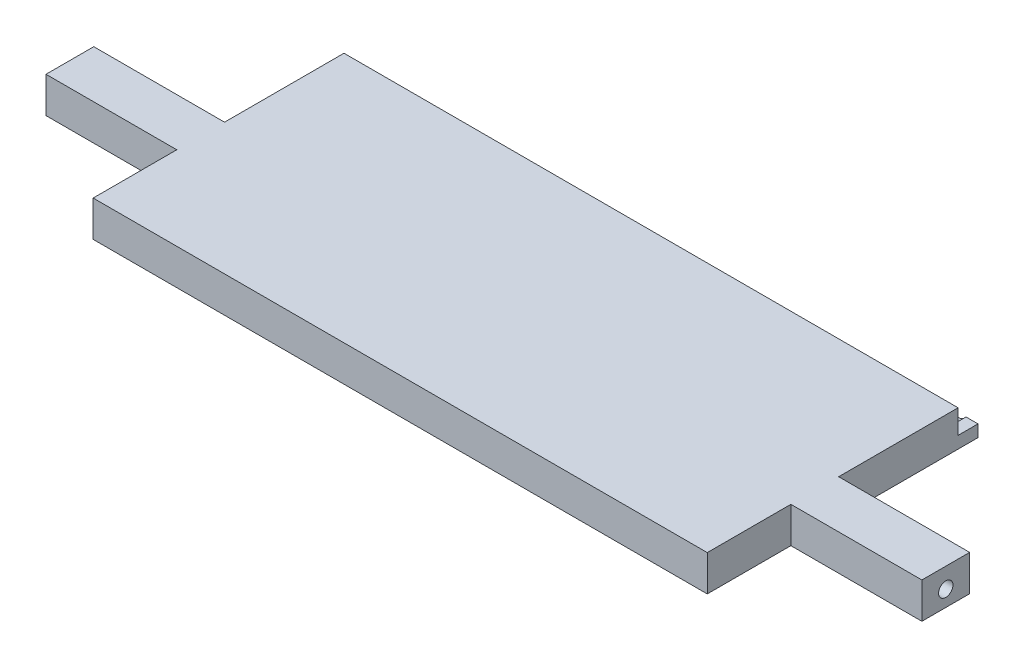
ISO-10303-21;
HEADER;
FILE_DESCRIPTION(('STEP AP214'),'2;1');
FILE_NAME('part.step','',(''),(''),'','','');
FILE_SCHEMA(('AUTOMOTIVE_DESIGN { 1 0 10303 214 1 1 1 1 }'));
ENDSEC;
DATA;
#1=APPLICATION_CONTEXT('core data for automotive mechanical design processes');
#2=APPLICATION_PROTOCOL_DEFINITION('international standard','automotive_design',2000,#1);
#3=PRODUCT_CONTEXT('',#1,'mechanical');
#4=PRODUCT('Part','Part','',(#3));
#5=PRODUCT_RELATED_PRODUCT_CATEGORY('part','',(#4));
#6=PRODUCT_DEFINITION_FORMATION('','',#4);
#7=PRODUCT_DEFINITION_CONTEXT('part definition',#1,'design');
#8=PRODUCT_DEFINITION('design','',#6,#7);
#9=PRODUCT_DEFINITION_SHAPE('','',#8);
#10=(LENGTH_UNIT() NAMED_UNIT(*) SI_UNIT(.MILLI.,.METRE.));
#11=(NAMED_UNIT(*) PLANE_ANGLE_UNIT() SI_UNIT($,.RADIAN.));
#12=(NAMED_UNIT(*) SI_UNIT($,.STERADIAN.) SOLID_ANGLE_UNIT());
#13=UNCERTAINTY_MEASURE_WITH_UNIT(LENGTH_MEASURE(1.E-05),#10,'distance_accuracy_value','');
#14=(GEOMETRIC_REPRESENTATION_CONTEXT(3) GLOBAL_UNCERTAINTY_ASSIGNED_CONTEXT((#13)) GLOBAL_UNIT_ASSIGNED_CONTEXT((#10,
#11,#12)) REPRESENTATION_CONTEXT('',''));
#15=CARTESIAN_POINT('',(0.,0.,0.));
#16=DIRECTION('',(0.,0.,1.));
#17=DIRECTION('',(1.,0.,0.));
#18=AXIS2_PLACEMENT_3D('',#15,#16,#17);
#19=CARTESIAN_POINT('',(0.,0.,0.));
#20=DIRECTION('',(0.,0.,-1.));
#21=DIRECTION('',(-1.,0.,0.));
#22=AXIS2_PLACEMENT_3D('',#19,#20,#21);
#23=PLANE('',#22);
#24=DIRECTION('',(0.,1.,0.));
#25=VECTOR('',#24,1.);
#26=CARTESIAN_POINT('',(187.09367605816,0.,0.));
#27=LINE('',#26,#25);
#28=CARTESIAN_POINT('',(187.09367605816,0.,0.));
#29=VERTEX_POINT('',#28);
#30=CARTESIAN_POINT('',(187.09367605816,3.,0.));
#31=VERTEX_POINT('',#30);
#32=EDGE_CURVE('E316',#29,#31,#27,.T.);
#33=ORIENTED_EDGE('',*,*,#32,.F.);
#34=DIRECTION('',(1.,0.,0.));
#35=VECTOR('',#34,1.);
#36=CARTESIAN_POINT('',(0.,0.,0.));
#37=LINE('',#36,#35);
#38=CARTESIAN_POINT('',(32.8463239418405,0.,0.));
#39=VERTEX_POINT('',#38);
#40=EDGE_CURVE('E474',#39,#29,#37,.T.);
#41=ORIENTED_EDGE('',*,*,#40,.F.);
#42=DIRECTION('',(0.,1.,0.));
#43=VECTOR('',#42,1.);
#44=CARTESIAN_POINT('',(32.8463239418405,0.,0.));
#45=LINE('',#44,#43);
#46=CARTESIAN_POINT('',(32.8463239418405,3.,0.));
#47=VERTEX_POINT('',#46);
#48=EDGE_CURVE('E336',#39,#47,#45,.T.);
#49=ORIENTED_EDGE('',*,*,#48,.T.);
#50=DIRECTION('',(-1.,0.,0.));
#51=VECTOR('',#50,1.);
#52=CARTESIAN_POINT('',(0.,3.,0.));
#53=LINE('',#52,#51);
#54=CARTESIAN_POINT('',(35.8463239418405,3.,0.));
#55=VERTEX_POINT('',#54);
#56=EDGE_CURVE('E349',#55,#47,#53,.T.);
#57=ORIENTED_EDGE('',*,*,#56,.F.);
#58=CARTESIAN_POINT('',(37.97,4.5,0.));
#59=DIRECTION('',(0.,0.,1.));
#60=DIRECTION('',(1.,0.,0.));
#61=AXIS2_PLACEMENT_3D('',#58,#59,#60);
#62=CIRCLE('',#61,2.6);
#63=CARTESIAN_POINT('',(40.0936760581595,3.,0.));
#64=VERTEX_POINT('',#63);
#65=EDGE_CURVE('E469',#55,#64,#62,.T.);
#66=ORIENTED_EDGE('',*,*,#65,.T.);
#67=CARTESIAN_POINT('',(53.8463239418405,3.,0.));
#68=VERTEX_POINT('',#67);
#69=EDGE_CURVE('E510',#68,#64,#53,.T.);
#70=ORIENTED_EDGE('',*,*,#69,.F.);
#71=CARTESIAN_POINT('',(55.97,4.5,0.));
#72=DIRECTION('',(0.,0.,1.));
#73=DIRECTION('',(1.,0.,0.));
#74=AXIS2_PLACEMENT_3D('',#71,#72,#73);
#75=CIRCLE('',#74,2.6);
#76=CARTESIAN_POINT('',(58.0936760581595,3.,0.));
#77=VERTEX_POINT('',#76);
#78=EDGE_CURVE('E464',#68,#77,#75,.T.);
#79=ORIENTED_EDGE('',*,*,#78,.T.);
#80=CARTESIAN_POINT('',(71.8463239418404,3.,0.));
#81=VERTEX_POINT('',#80);
#82=EDGE_CURVE('E511',#81,#77,#53,.T.);
#83=ORIENTED_EDGE('',*,*,#82,.F.);
#84=CARTESIAN_POINT('',(73.97,4.5,0.));
#85=DIRECTION('',(0.,0.,1.));
#86=DIRECTION('',(1.,0.,0.));
#87=AXIS2_PLACEMENT_3D('',#84,#85,#86);
#88=CIRCLE('',#87,2.6);
#89=CARTESIAN_POINT('',(76.0936760581595,3.,0.));
#90=VERTEX_POINT('',#89);
#91=EDGE_CURVE('E458',#81,#90,#88,.T.);
#92=ORIENTED_EDGE('',*,*,#91,.T.);
#93=CARTESIAN_POINT('',(89.8463239418404,3.,0.));
#94=VERTEX_POINT('',#93);
#95=EDGE_CURVE('E514',#94,#90,#53,.T.);
#96=ORIENTED_EDGE('',*,*,#95,.F.);
#97=CARTESIAN_POINT('',(91.97,4.5,0.));
#98=DIRECTION('',(0.,0.,1.));
#99=DIRECTION('',(1.,0.,0.));
#100=AXIS2_PLACEMENT_3D('',#97,#98,#99);
#101=CIRCLE('',#100,2.6);
#102=CARTESIAN_POINT('',(94.0936760581595,3.,0.));
#103=VERTEX_POINT('',#102);
#104=EDGE_CURVE('E452',#94,#103,#101,.T.);
#105=ORIENTED_EDGE('',*,*,#104,.T.);
#106=CARTESIAN_POINT('',(107.84632394184,3.,0.));
#107=VERTEX_POINT('',#106);
#108=EDGE_CURVE('E517',#107,#103,#53,.T.);
#109=ORIENTED_EDGE('',*,*,#108,.F.);
#110=CARTESIAN_POINT('',(109.97,4.5,0.));
#111=DIRECTION('',(0.,0.,1.));
#112=DIRECTION('',(1.,0.,0.));
#113=AXIS2_PLACEMENT_3D('',#110,#111,#112);
#114=CIRCLE('',#113,2.6);
#115=CARTESIAN_POINT('',(112.093676058159,3.,0.));
#116=VERTEX_POINT('',#115);
#117=EDGE_CURVE('E446',#107,#116,#114,.T.);
#118=ORIENTED_EDGE('',*,*,#117,.T.);
#119=CARTESIAN_POINT('',(125.84632394184,3.,0.));
#120=VERTEX_POINT('',#119);
#121=EDGE_CURVE('E520',#120,#116,#53,.T.);
#122=ORIENTED_EDGE('',*,*,#121,.F.);
#123=CARTESIAN_POINT('',(127.97,4.5,0.));
#124=DIRECTION('',(0.,0.,1.));
#125=DIRECTION('',(1.,0.,0.));
#126=AXIS2_PLACEMENT_3D('',#123,#124,#125);
#127=CIRCLE('',#126,2.59999999999999);
#128=CARTESIAN_POINT('',(130.093676058159,3.,0.));
#129=VERTEX_POINT('',#128);
#130=EDGE_CURVE('E440',#120,#129,#127,.T.);
#131=ORIENTED_EDGE('',*,*,#130,.T.);
#132=CARTESIAN_POINT('',(143.84632394184,3.,0.));
#133=VERTEX_POINT('',#132);
#134=EDGE_CURVE('E523',#133,#129,#53,.T.);
#135=ORIENTED_EDGE('',*,*,#134,.F.);
#136=CARTESIAN_POINT('',(145.97,4.5,0.));
#137=DIRECTION('',(0.,0.,1.));
#138=DIRECTION('',(1.,0.,0.));
#139=AXIS2_PLACEMENT_3D('',#136,#137,#138);
#140=CIRCLE('',#139,2.59999999999999);
#141=CARTESIAN_POINT('',(148.093676058159,3.,0.));
#142=VERTEX_POINT('',#141);
#143=EDGE_CURVE('E434',#133,#142,#140,.T.);
#144=ORIENTED_EDGE('',*,*,#143,.T.);
#145=CARTESIAN_POINT('',(161.84632394184,3.,0.));
#146=VERTEX_POINT('',#145);
#147=EDGE_CURVE('E526',#146,#142,#53,.T.);
#148=ORIENTED_EDGE('',*,*,#147,.F.);
#149=CARTESIAN_POINT('',(163.97,4.5,0.));
#150=DIRECTION('',(0.,0.,1.));
#151=DIRECTION('',(1.,0.,0.));
#152=AXIS2_PLACEMENT_3D('',#149,#150,#151);
#153=CIRCLE('',#152,2.59999999999999);
#154=CARTESIAN_POINT('',(166.093676058159,3.,0.));
#155=VERTEX_POINT('',#154);
#156=EDGE_CURVE('E428',#146,#155,#153,.T.);
#157=ORIENTED_EDGE('',*,*,#156,.T.);
#158=CARTESIAN_POINT('',(179.84632394184,3.,0.));
#159=VERTEX_POINT('',#158);
#160=EDGE_CURVE('E355',#159,#155,#53,.T.);
#161=ORIENTED_EDGE('',*,*,#160,.F.);
#162=CARTESIAN_POINT('',(181.97,4.5,0.));
#163=DIRECTION('',(0.,0.,1.));
#164=DIRECTION('',(1.,0.,0.));
#165=AXIS2_PLACEMENT_3D('',#162,#163,#164);
#166=CIRCLE('',#165,2.59999999999999);
#167=CARTESIAN_POINT('',(184.09367605816,3.,0.));
#168=VERTEX_POINT('',#167);
#169=EDGE_CURVE('E422',#159,#168,#166,.T.);
#170=ORIENTED_EDGE('',*,*,#169,.T.);
#171=EDGE_CURVE('E352',#31,#168,#53,.T.);
#172=ORIENTED_EDGE('',*,*,#171,.F.);
#173=EDGE_LOOP('',(#33,#41,#49,#57,#66,#70,#79,#83,#92,#96,#105,#109,#118,#122,#131,#135,#144,
#148,#157,#161,#170,#172));
#174=FACE_BOUND('',#173,.T.);
#175=ADVANCED_FACE('F33',(#174),#23,.T.);
#176=CARTESIAN_POINT('',(37.97,4.5,65.));
#177=DIRECTION('',(0.,0.,-1.));
#178=DIRECTION('',(-1.,0.,0.));
#179=AXIS2_PLACEMENT_3D('',#176,#177,#178);
#180=CYLINDRICAL_SURFACE('',#179,2.6);
#181=CARTESIAN_POINT('',(37.97,4.5,65.));
#182=DIRECTION('',(0.,0.,1.));
#183=DIRECTION('',(1.,0.,0.));
#184=AXIS2_PLACEMENT_3D('',#181,#182,#183);
#185=CIRCLE('',#184,2.6);
#186=CARTESIAN_POINT('',(40.57,4.5,65.));
#187=VERTEX_POINT('',#186);
#188=EDGE_CURVE('E282',#187,#187,#185,.T.);
#189=ORIENTED_EDGE('',*,*,#188,.T.);
#190=EDGE_LOOP('',(#189));
#191=FACE_BOUND('',#190,.T.);
#192=CARTESIAN_POINT('',(37.97,4.5,5.));
#193=DIRECTION('',(0.,0.,1.));
#194=DIRECTION('',(1.,0.,0.));
#195=AXIS2_PLACEMENT_3D('',#192,#193,#194);
#196=CIRCLE('',#195,2.6);
#197=CARTESIAN_POINT('',(40.0936760581595,3.,5.));
#198=VERTEX_POINT('',#197);
#199=CARTESIAN_POINT('',(35.8463239418405,3.,5.));
#200=VERTEX_POINT('',#199);
#201=EDGE_CURVE('E419',#198,#200,#196,.T.);
#202=ORIENTED_EDGE('',*,*,#201,.F.);
#203=DIRECTION('',(0.,0.,-1.));
#204=VECTOR('',#203,1.);
#205=CARTESIAN_POINT('',(40.0936760581595,3.,65.));
#206=LINE('',#205,#204);
#207=EDGE_CURVE('E402',#198,#64,#206,.T.);
#208=ORIENTED_EDGE('',*,*,#207,.T.);
#209=ORIENTED_EDGE('',*,*,#65,.F.);
#210=DIRECTION('',(0.,0.,-1.));
#211=VECTOR('',#210,1.);
#212=CARTESIAN_POINT('',(35.8463239418405,3.,65.));
#213=LINE('',#212,#211);
#214=EDGE_CURVE('E399',#55,#200,#213,.F.);
#215=ORIENTED_EDGE('',*,*,#214,.T.);
#216=EDGE_LOOP('',(#202,#208,#209,#215));
#217=FACE_BOUND('',#216,.T.);
#218=ADVANCED_FACE('F578',(#191,#217),#180,.F.);
#219=CARTESIAN_POINT('',(55.97,4.5,65.));
#220=DIRECTION('',(0.,0.,-1.));
#221=DIRECTION('',(-1.,0.,0.));
#222=AXIS2_PLACEMENT_3D('',#219,#220,#221);
#223=CYLINDRICAL_SURFACE('',#222,2.6);
#224=CARTESIAN_POINT('',(55.97,4.5,65.));
#225=DIRECTION('',(0.,0.,1.));
#226=DIRECTION('',(1.,0.,0.));
#227=AXIS2_PLACEMENT_3D('',#224,#225,#226);
#228=CIRCLE('',#227,2.6);
#229=CARTESIAN_POINT('',(58.57,4.5,65.));
#230=VERTEX_POINT('',#229);
#231=EDGE_CURVE('E461',#230,#230,#228,.T.);
#232=ORIENTED_EDGE('',*,*,#231,.T.);
#233=EDGE_LOOP('',(#232));
#234=FACE_BOUND('',#233,.T.);
#235=CARTESIAN_POINT('',(55.97,4.5,5.));
#236=DIRECTION('',(0.,0.,1.));
#237=DIRECTION('',(1.,0.,0.));
#238=AXIS2_PLACEMENT_3D('',#235,#236,#237);
#239=CIRCLE('',#238,2.6);
#240=CARTESIAN_POINT('',(58.0936760581595,3.,5.));
#241=VERTEX_POINT('',#240);
#242=CARTESIAN_POINT('',(53.8463239418405,3.,5.));
#243=VERTEX_POINT('',#242);
#244=EDGE_CURVE('E417',#241,#243,#239,.T.);
#245=ORIENTED_EDGE('',*,*,#244,.F.);
#246=DIRECTION('',(0.,0.,-1.));
#247=VECTOR('',#246,1.);
#248=CARTESIAN_POINT('',(58.0936760581595,3.,65.));
#249=LINE('',#248,#247);
#250=EDGE_CURVE('E396',#241,#77,#249,.T.);
#251=ORIENTED_EDGE('',*,*,#250,.T.);
#252=ORIENTED_EDGE('',*,*,#78,.F.);
#253=DIRECTION('',(0.,0.,-1.));
#254=VECTOR('',#253,1.);
#255=CARTESIAN_POINT('',(53.8463239418405,3.,65.));
#256=LINE('',#255,#254);
#257=EDGE_CURVE('E393',#68,#243,#256,.F.);
#258=ORIENTED_EDGE('',*,*,#257,.T.);
#259=EDGE_LOOP('',(#245,#251,#252,#258));
#260=FACE_BOUND('',#259,.T.);
#261=ADVANCED_FACE('F582',(#234,#260),#223,.F.);
#262=CARTESIAN_POINT('',(73.97,4.5,65.));
#263=DIRECTION('',(0.,0.,-1.));
#264=DIRECTION('',(-1.,0.,0.));
#265=AXIS2_PLACEMENT_3D('',#262,#263,#264);
#266=CYLINDRICAL_SURFACE('',#265,2.6);
#267=CARTESIAN_POINT('',(73.97,4.5,65.));
#268=DIRECTION('',(0.,0.,1.));
#269=DIRECTION('',(1.,0.,0.));
#270=AXIS2_PLACEMENT_3D('',#267,#268,#269);
#271=CIRCLE('',#270,2.6);
#272=CARTESIAN_POINT('',(76.57,4.5,65.));
#273=VERTEX_POINT('',#272);
#274=EDGE_CURVE('E455',#273,#273,#271,.T.);
#275=ORIENTED_EDGE('',*,*,#274,.T.);
#276=EDGE_LOOP('',(#275));
#277=FACE_BOUND('',#276,.T.);
#278=CARTESIAN_POINT('',(73.97,4.5,5.));
#279=DIRECTION('',(0.,0.,1.));
#280=DIRECTION('',(1.,0.,0.));
#281=AXIS2_PLACEMENT_3D('',#278,#279,#280);
#282=CIRCLE('',#281,2.6);
#283=CARTESIAN_POINT('',(76.0936760581595,3.,5.));
#284=VERTEX_POINT('',#283);
#285=CARTESIAN_POINT('',(71.8463239418404,3.,5.));
#286=VERTEX_POINT('',#285);
#287=EDGE_CURVE('E415',#284,#286,#282,.T.);
#288=ORIENTED_EDGE('',*,*,#287,.F.);
#289=DIRECTION('',(0.,0.,-1.));
#290=VECTOR('',#289,1.);
#291=CARTESIAN_POINT('',(76.0936760581595,3.,65.));
#292=LINE('',#291,#290);
#293=EDGE_CURVE('E390',#284,#90,#292,.T.);
#294=ORIENTED_EDGE('',*,*,#293,.T.);
#295=ORIENTED_EDGE('',*,*,#91,.F.);
#296=DIRECTION('',(0.,0.,-1.));
#297=VECTOR('',#296,1.);
#298=CARTESIAN_POINT('',(71.8463239418404,3.,65.));
#299=LINE('',#298,#297);
#300=EDGE_CURVE('E387',#81,#286,#299,.F.);
#301=ORIENTED_EDGE('',*,*,#300,.T.);
#302=EDGE_LOOP('',(#288,#294,#295,#301));
#303=FACE_BOUND('',#302,.T.);
#304=ADVANCED_FACE('F612',(#277,#303),#266,.F.);
#305=CARTESIAN_POINT('',(91.97,4.5,65.));
#306=DIRECTION('',(0.,0.,-1.));
#307=DIRECTION('',(-1.,0.,0.));
#308=AXIS2_PLACEMENT_3D('',#305,#306,#307);
#309=CYLINDRICAL_SURFACE('',#308,2.6);
#310=CARTESIAN_POINT('',(91.97,4.5,65.));
#311=DIRECTION('',(0.,0.,1.));
#312=DIRECTION('',(1.,0.,0.));
#313=AXIS2_PLACEMENT_3D('',#310,#311,#312);
#314=CIRCLE('',#313,2.6);
#315=CARTESIAN_POINT('',(94.57,4.5,65.));
#316=VERTEX_POINT('',#315);
#317=EDGE_CURVE('E449',#316,#316,#314,.T.);
#318=ORIENTED_EDGE('',*,*,#317,.T.);
#319=EDGE_LOOP('',(#318));
#320=FACE_BOUND('',#319,.T.);
#321=CARTESIAN_POINT('',(91.97,4.5,5.));
#322=DIRECTION('',(0.,0.,1.));
#323=DIRECTION('',(1.,0.,0.));
#324=AXIS2_PLACEMENT_3D('',#321,#322,#323);
#325=CIRCLE('',#324,2.6);
#326=CARTESIAN_POINT('',(94.0936760581595,3.,5.));
#327=VERTEX_POINT('',#326);
#328=CARTESIAN_POINT('',(89.8463239418404,3.,5.));
#329=VERTEX_POINT('',#328);
#330=EDGE_CURVE('E413',#327,#329,#325,.T.);
#331=ORIENTED_EDGE('',*,*,#330,.F.);
#332=DIRECTION('',(0.,0.,-1.));
#333=VECTOR('',#332,1.);
#334=CARTESIAN_POINT('',(94.0936760581595,3.,65.));
#335=LINE('',#334,#333);
#336=EDGE_CURVE('E384',#327,#103,#335,.T.);
#337=ORIENTED_EDGE('',*,*,#336,.T.);
#338=ORIENTED_EDGE('',*,*,#104,.F.);
#339=DIRECTION('',(0.,0.,-1.));
#340=VECTOR('',#339,1.);
#341=CARTESIAN_POINT('',(89.8463239418404,3.,65.));
#342=LINE('',#341,#340);
#343=EDGE_CURVE('E381',#94,#329,#342,.F.);
#344=ORIENTED_EDGE('',*,*,#343,.T.);
#345=EDGE_LOOP('',(#331,#337,#338,#344));
#346=FACE_BOUND('',#345,.T.);
#347=ADVANCED_FACE('F607',(#320,#346),#309,.F.);
#348=CARTESIAN_POINT('',(109.97,4.5,65.));
#349=DIRECTION('',(0.,0.,-1.));
#350=DIRECTION('',(-1.,0.,0.));
#351=AXIS2_PLACEMENT_3D('',#348,#349,#350);
#352=CYLINDRICAL_SURFACE('',#351,2.6);
#353=CARTESIAN_POINT('',(109.97,4.5,65.));
#354=DIRECTION('',(0.,0.,1.));
#355=DIRECTION('',(1.,0.,0.));
#356=AXIS2_PLACEMENT_3D('',#353,#354,#355);
#357=CIRCLE('',#356,2.6);
#358=CARTESIAN_POINT('',(112.57,4.5,65.));
#359=VERTEX_POINT('',#358);
#360=EDGE_CURVE('E443',#359,#359,#357,.T.);
#361=ORIENTED_EDGE('',*,*,#360,.T.);
#362=EDGE_LOOP('',(#361));
#363=FACE_BOUND('',#362,.T.);
#364=CARTESIAN_POINT('',(109.97,4.5,5.));
#365=DIRECTION('',(0.,0.,1.));
#366=DIRECTION('',(1.,0.,0.));
#367=AXIS2_PLACEMENT_3D('',#364,#365,#366);
#368=CIRCLE('',#367,2.6);
#369=CARTESIAN_POINT('',(112.093676058159,3.,5.));
#370=VERTEX_POINT('',#369);
#371=CARTESIAN_POINT('',(107.84632394184,3.,5.));
#372=VERTEX_POINT('',#371);
#373=EDGE_CURVE('E411',#370,#372,#368,.T.);
#374=ORIENTED_EDGE('',*,*,#373,.F.);
#375=DIRECTION('',(0.,0.,-1.));
#376=VECTOR('',#375,1.);
#377=CARTESIAN_POINT('',(112.093676058159,3.,65.));
#378=LINE('',#377,#376);
#379=EDGE_CURVE('E378',#370,#116,#378,.T.);
#380=ORIENTED_EDGE('',*,*,#379,.T.);
#381=ORIENTED_EDGE('',*,*,#117,.F.);
#382=DIRECTION('',(0.,0.,-1.));
#383=VECTOR('',#382,1.);
#384=CARTESIAN_POINT('',(107.84632394184,3.,65.));
#385=LINE('',#384,#383);
#386=EDGE_CURVE('E375',#107,#372,#385,.F.);
#387=ORIENTED_EDGE('',*,*,#386,.T.);
#388=EDGE_LOOP('',(#374,#380,#381,#387));
#389=FACE_BOUND('',#388,.T.);
#390=ADVANCED_FACE('F604',(#363,#389),#352,.F.);
#391=CARTESIAN_POINT('',(127.97,4.5,65.));
#392=DIRECTION('',(0.,0.,-1.));
#393=DIRECTION('',(-1.,0.,0.));
#394=AXIS2_PLACEMENT_3D('',#391,#392,#393);
#395=CYLINDRICAL_SURFACE('',#394,2.59999999999999);
#396=CARTESIAN_POINT('',(127.97,4.5,65.));
#397=DIRECTION('',(0.,0.,1.));
#398=DIRECTION('',(1.,0.,0.));
#399=AXIS2_PLACEMENT_3D('',#396,#397,#398);
#400=CIRCLE('',#399,2.59999999999999);
#401=CARTESIAN_POINT('',(130.57,4.5,65.));
#402=VERTEX_POINT('',#401);
#403=EDGE_CURVE('E437',#402,#402,#400,.T.);
#404=ORIENTED_EDGE('',*,*,#403,.T.);
#405=EDGE_LOOP('',(#404));
#406=FACE_BOUND('',#405,.T.);
#407=CARTESIAN_POINT('',(127.97,4.5,5.));
#408=DIRECTION('',(0.,0.,1.));
#409=DIRECTION('',(1.,0.,0.));
#410=AXIS2_PLACEMENT_3D('',#407,#408,#409);
#411=CIRCLE('',#410,2.59999999999999);
#412=CARTESIAN_POINT('',(130.093676058159,3.,5.));
#413=VERTEX_POINT('',#412);
#414=CARTESIAN_POINT('',(125.84632394184,3.,5.));
#415=VERTEX_POINT('',#414);
#416=EDGE_CURVE('E409',#413,#415,#411,.T.);
#417=ORIENTED_EDGE('',*,*,#416,.F.);
#418=DIRECTION('',(0.,0.,-1.));
#419=VECTOR('',#418,1.);
#420=CARTESIAN_POINT('',(130.093676058159,3.,65.));
#421=LINE('',#420,#419);
#422=EDGE_CURVE('E372',#413,#129,#421,.T.);
#423=ORIENTED_EDGE('',*,*,#422,.T.);
#424=ORIENTED_EDGE('',*,*,#130,.F.);
#425=DIRECTION('',(0.,0.,-1.));
#426=VECTOR('',#425,1.);
#427=CARTESIAN_POINT('',(125.84632394184,3.,65.));
#428=LINE('',#427,#426);
#429=EDGE_CURVE('E369',#120,#415,#428,.F.);
#430=ORIENTED_EDGE('',*,*,#429,.T.);
#431=EDGE_LOOP('',(#417,#423,#424,#430));
#432=FACE_BOUND('',#431,.T.);
#433=ADVANCED_FACE('F601',(#406,#432),#395,.F.);
#434=CARTESIAN_POINT('',(145.97,4.5,65.));
#435=DIRECTION('',(0.,0.,-1.));
#436=DIRECTION('',(-1.,0.,0.));
#437=AXIS2_PLACEMENT_3D('',#434,#435,#436);
#438=CYLINDRICAL_SURFACE('',#437,2.59999999999999);
#439=CARTESIAN_POINT('',(145.97,4.5,65.));
#440=DIRECTION('',(0.,0.,1.));
#441=DIRECTION('',(1.,0.,0.));
#442=AXIS2_PLACEMENT_3D('',#439,#440,#441);
#443=CIRCLE('',#442,2.59999999999999);
#444=CARTESIAN_POINT('',(148.57,4.5,65.));
#445=VERTEX_POINT('',#444);
#446=EDGE_CURVE('E431',#445,#445,#443,.T.);
#447=ORIENTED_EDGE('',*,*,#446,.T.);
#448=EDGE_LOOP('',(#447));
#449=FACE_BOUND('',#448,.T.);
#450=CARTESIAN_POINT('',(145.97,4.5,5.));
#451=DIRECTION('',(0.,0.,1.));
#452=DIRECTION('',(1.,0.,0.));
#453=AXIS2_PLACEMENT_3D('',#450,#451,#452);
#454=CIRCLE('',#453,2.59999999999999);
#455=CARTESIAN_POINT('',(148.093676058159,3.,5.));
#456=VERTEX_POINT('',#455);
#457=CARTESIAN_POINT('',(143.84632394184,3.,5.));
#458=VERTEX_POINT('',#457);
#459=EDGE_CURVE('E407',#456,#458,#454,.T.);
#460=ORIENTED_EDGE('',*,*,#459,.F.);
#461=DIRECTION('',(0.,0.,-1.));
#462=VECTOR('',#461,1.);
#463=CARTESIAN_POINT('',(148.093676058159,3.,65.));
#464=LINE('',#463,#462);
#465=EDGE_CURVE('E366',#456,#142,#464,.T.);
#466=ORIENTED_EDGE('',*,*,#465,.T.);
#467=ORIENTED_EDGE('',*,*,#143,.F.);
#468=DIRECTION('',(0.,0.,-1.));
#469=VECTOR('',#468,1.);
#470=CARTESIAN_POINT('',(143.84632394184,3.,65.));
#471=LINE('',#470,#469);
#472=EDGE_CURVE('E363',#133,#458,#471,.F.);
#473=ORIENTED_EDGE('',*,*,#472,.T.);
#474=EDGE_LOOP('',(#460,#466,#467,#473));
#475=FACE_BOUND('',#474,.T.);
#476=ADVANCED_FACE('F543',(#449,#475),#438,.F.);
#477=CARTESIAN_POINT('',(163.97,4.5,65.));
#478=DIRECTION('',(0.,0.,-1.));
#479=DIRECTION('',(-1.,0.,0.));
#480=AXIS2_PLACEMENT_3D('',#477,#478,#479);
#481=CYLINDRICAL_SURFACE('',#480,2.59999999999999);
#482=CARTESIAN_POINT('',(163.97,4.5,65.));
#483=DIRECTION('',(0.,0.,1.));
#484=DIRECTION('',(1.,0.,0.));
#485=AXIS2_PLACEMENT_3D('',#482,#483,#484);
#486=CIRCLE('',#485,2.59999999999999);
#487=CARTESIAN_POINT('',(166.57,4.5,65.));
#488=VERTEX_POINT('',#487);
#489=EDGE_CURVE('E425',#488,#488,#486,.T.);
#490=ORIENTED_EDGE('',*,*,#489,.T.);
#491=EDGE_LOOP('',(#490));
#492=FACE_BOUND('',#491,.T.);
#493=CARTESIAN_POINT('',(163.97,4.5,5.));
#494=DIRECTION('',(0.,0.,1.));
#495=DIRECTION('',(1.,0.,0.));
#496=AXIS2_PLACEMENT_3D('',#493,#494,#495);
#497=CIRCLE('',#496,2.59999999999999);
#498=CARTESIAN_POINT('',(166.093676058159,3.,5.));
#499=VERTEX_POINT('',#498);
#500=CARTESIAN_POINT('',(161.84632394184,3.,5.));
#501=VERTEX_POINT('',#500);
#502=EDGE_CURVE('E405',#499,#501,#497,.T.);
#503=ORIENTED_EDGE('',*,*,#502,.F.);
#504=DIRECTION('',(0.,0.,-1.));
#505=VECTOR('',#504,1.);
#506=CARTESIAN_POINT('',(166.093676058159,3.,65.));
#507=LINE('',#506,#505);
#508=EDGE_CURVE('E360',#499,#155,#507,.T.);
#509=ORIENTED_EDGE('',*,*,#508,.T.);
#510=ORIENTED_EDGE('',*,*,#156,.F.);
#511=DIRECTION('',(0.,0.,-1.));
#512=VECTOR('',#511,1.);
#513=CARTESIAN_POINT('',(161.84632394184,3.,65.));
#514=LINE('',#513,#512);
#515=EDGE_CURVE('E354',#146,#501,#514,.F.);
#516=ORIENTED_EDGE('',*,*,#515,.T.);
#517=EDGE_LOOP('',(#503,#509,#510,#516));
#518=FACE_BOUND('',#517,.T.);
#519=ADVANCED_FACE('F539',(#492,#518),#481,.F.);
#520=CARTESIAN_POINT('',(181.97,4.5,65.));
#521=DIRECTION('',(0.,0.,-1.));
#522=DIRECTION('',(-1.,0.,0.));
#523=AXIS2_PLACEMENT_3D('',#520,#521,#522);
#524=CYLINDRICAL_SURFACE('',#523,2.59999999999999);
#525=CARTESIAN_POINT('',(181.97,4.5,65.));
#526=DIRECTION('',(0.,0.,1.));
#527=DIRECTION('',(1.,0.,0.));
#528=AXIS2_PLACEMENT_3D('',#525,#526,#527);
#529=CIRCLE('',#528,2.59999999999999);
#530=CARTESIAN_POINT('',(184.57,4.5,65.));
#531=VERTEX_POINT('',#530);
#532=EDGE_CURVE('E274',#531,#531,#529,.T.);
#533=ORIENTED_EDGE('',*,*,#532,.T.);
#534=EDGE_LOOP('',(#533));
#535=FACE_BOUND('',#534,.T.);
#536=CARTESIAN_POINT('',(181.97,4.5,5.));
#537=DIRECTION('',(0.,0.,1.));
#538=DIRECTION('',(1.,0.,0.));
#539=AXIS2_PLACEMENT_3D('',#536,#537,#538);
#540=CIRCLE('',#539,2.59999999999999);
#541=CARTESIAN_POINT('',(184.09367605816,3.,5.));
#542=VERTEX_POINT('',#541);
#543=CARTESIAN_POINT('',(179.84632394184,3.,5.));
#544=VERTEX_POINT('',#543);
#545=EDGE_CURVE('E492',#542,#544,#540,.T.);
#546=ORIENTED_EDGE('',*,*,#545,.F.);
#547=DIRECTION('',(0.,0.,-1.));
#548=VECTOR('',#547,1.);
#549=CARTESIAN_POINT('',(184.09367605816,3.,65.));
#550=LINE('',#549,#548);
#551=EDGE_CURVE('E495',#542,#168,#550,.T.);
#552=ORIENTED_EDGE('',*,*,#551,.T.);
#553=ORIENTED_EDGE('',*,*,#169,.F.);
#554=DIRECTION('',(0.,0.,-1.));
#555=VECTOR('',#554,1.);
#556=CARTESIAN_POINT('',(179.84632394184,3.,65.));
#557=LINE('',#556,#555);
#558=EDGE_CURVE('E489',#159,#544,#557,.F.);
#559=ORIENTED_EDGE('',*,*,#558,.T.);
#560=EDGE_LOOP('',(#546,#552,#553,#559));
#561=FACE_BOUND('',#560,.T.);
#562=ADVANCED_FACE('F562',(#535,#561),#524,.F.);
#563=CARTESIAN_POINT('',(0.,0.,65.));
#564=DIRECTION('',(1.,0.,0.));
#565=DIRECTION('',(0.,0.,-1.));
#566=AXIS2_PLACEMENT_3D('',#563,#564,#565);
#567=PLANE('',#566);
#568=CARTESIAN_POINT('',(0.,4.,41.));
#569=DIRECTION('',(-1.,0.,0.));
#570=DIRECTION('',(0.,0.,1.));
#571=AXIS2_PLACEMENT_3D('',#568,#569,#570);
#572=CIRCLE('',#571,1.8);
#573=CARTESIAN_POINT('',(0.,4.,42.8));
#574=VERTEX_POINT('',#573);
#575=EDGE_CURVE('E278',#574,#574,#572,.T.);
#576=ORIENTED_EDGE('',*,*,#575,.F.);
#577=EDGE_LOOP('',(#576));
#578=FACE_BOUND('',#577,.T.);
#579=DIRECTION('',(0.,0.,-1.));
#580=VECTOR('',#579,1.);
#581=CARTESIAN_POINT('',(0.,0.,65.));
#582=LINE('',#581,#580);
#583=CARTESIAN_POINT('',(0.,0.,47.));
#584=VERTEX_POINT('',#583);
#585=CARTESIAN_POINT('',(0.,0.,35.));
#586=VERTEX_POINT('',#585);
#587=EDGE_CURVE('E486',#584,#586,#582,.T.);
#588=ORIENTED_EDGE('',*,*,#587,.F.);
#589=DIRECTION('',(0.,1.,0.));
#590=VECTOR('',#589,1.);
#591=CARTESIAN_POINT('',(0.,0.,47.));
#592=LINE('',#591,#590);
#593=CARTESIAN_POINT('',(0.,9.,47.));
#594=VERTEX_POINT('',#593);
#595=EDGE_CURVE('E304',#584,#594,#592,.T.);
#596=ORIENTED_EDGE('',*,*,#595,.T.);
#597=DIRECTION('',(0.,0.,-1.));
#598=VECTOR('',#597,1.);
#599=CARTESIAN_POINT('',(0.,9.,65.));
#600=LINE('',#599,#598);
#601=CARTESIAN_POINT('',(0.,9.,35.));
#602=VERTEX_POINT('',#601);
#603=EDGE_CURVE('E477',#594,#602,#600,.T.);
#604=ORIENTED_EDGE('',*,*,#603,.T.);
#605=DIRECTION('',(0.,1.,0.));
#606=VECTOR('',#605,1.);
#607=CARTESIAN_POINT('',(0.,0.,35.));
#608=LINE('',#607,#606);
#609=EDGE_CURVE('E332',#586,#602,#608,.T.);
#610=ORIENTED_EDGE('',*,*,#609,.F.);
#611=EDGE_LOOP('',(#588,#596,#604,#610));
#612=FACE_BOUND('',#611,.T.);
#613=ADVANCED_FACE('F35',(#578,#612),#567,.F.);
#614=CARTESIAN_POINT('',(0.,0.,65.));
#615=DIRECTION('',(0.,1.,0.));
#616=DIRECTION('',(0.,0.,1.));
#617=AXIS2_PLACEMENT_3D('',#614,#615,#616);
#618=PLANE('',#617);
#619=DIRECTION('',(0.,0.,-1.));
#620=VECTOR('',#619,1.);
#621=CARTESIAN_POINT('',(32.8463239418405,0.,65.));
#622=LINE('',#621,#620);
#623=CARTESIAN_POINT('',(32.8463239418405,0.,68.));
#624=VERTEX_POINT('',#623);
#625=CARTESIAN_POINT('',(32.8463239418405,0.,47.));
#626=VERTEX_POINT('',#625);
#627=EDGE_CURVE('E242',#624,#626,#622,.T.);
#628=ORIENTED_EDGE('',*,*,#627,.T.);
#629=DIRECTION('',(-1.,0.,0.));
#630=VECTOR('',#629,1.);
#631=CARTESIAN_POINT('',(0.,0.,47.));
#632=LINE('',#631,#630);
#633=EDGE_CURVE('E252',#626,#584,#632,.T.);
#634=ORIENTED_EDGE('',*,*,#633,.T.);
#635=ORIENTED_EDGE('',*,*,#587,.T.);
#636=DIRECTION('',(1.,0.,0.));
#637=VECTOR('',#636,1.);
#638=CARTESIAN_POINT('',(0.,0.,35.));
#639=LINE('',#638,#637);
#640=CARTESIAN_POINT('',(32.8463239418405,0.,35.));
#641=VERTEX_POINT('',#640);
#642=EDGE_CURVE('E325',#586,#641,#639,.T.);
#643=ORIENTED_EDGE('',*,*,#642,.T.);
#644=DIRECTION('',(0.,0.,-1.));
#645=VECTOR('',#644,1.);
#646=CARTESIAN_POINT('',(32.8463239418405,0.,0.));
#647=LINE('',#646,#645);
#648=EDGE_CURVE('E328',#641,#39,#647,.T.);
#649=ORIENTED_EDGE('',*,*,#648,.T.);
#650=ORIENTED_EDGE('',*,*,#40,.T.);
#651=DIRECTION('',(0.,0.,1.));
#652=VECTOR('',#651,1.);
#653=CARTESIAN_POINT('',(187.09367605816,0.,0.));
#654=LINE('',#653,#652);
#655=CARTESIAN_POINT('',(187.09367605816,0.,35.));
#656=VERTEX_POINT('',#655);
#657=EDGE_CURVE('E309',#29,#656,#654,.T.);
#658=ORIENTED_EDGE('',*,*,#657,.T.);
#659=DIRECTION('',(1.,0.,0.));
#660=VECTOR('',#659,1.);
#661=CARTESIAN_POINT('',(220.,0.,35.));
#662=LINE('',#661,#660);
#663=CARTESIAN_POINT('',(220.,0.,35.));
#664=VERTEX_POINT('',#663);
#665=EDGE_CURVE('E312',#656,#664,#662,.T.);
#666=ORIENTED_EDGE('',*,*,#665,.T.);
#667=DIRECTION('',(0.,0.,-1.));
#668=VECTOR('',#667,1.);
#669=CARTESIAN_POINT('',(220.,0.,65.));
#670=LINE('',#669,#668);
#671=CARTESIAN_POINT('',(220.,0.,47.));
#672=VERTEX_POINT('',#671);
#673=EDGE_CURVE('E483',#672,#664,#670,.T.);
#674=ORIENTED_EDGE('',*,*,#673,.F.);
#675=DIRECTION('',(-1.,0.,0.));
#676=VECTOR('',#675,1.);
#677=CARTESIAN_POINT('',(220.,0.,47.));
#678=LINE('',#677,#676);
#679=CARTESIAN_POINT('',(187.09367605816,0.,47.));
#680=VERTEX_POINT('',#679);
#681=EDGE_CURVE('E289',#672,#680,#678,.T.);
#682=ORIENTED_EDGE('',*,*,#681,.T.);
#683=DIRECTION('',(0.,0.,1.));
#684=VECTOR('',#683,1.);
#685=CARTESIAN_POINT('',(187.09367605816,0.,65.));
#686=LINE('',#685,#684);
#687=CARTESIAN_POINT('',(187.09367605816,0.,68.));
#688=VERTEX_POINT('',#687);
#689=EDGE_CURVE('E260',#680,#688,#686,.T.);
#690=ORIENTED_EDGE('',*,*,#689,.T.);
#691=DIRECTION('',(1.,0.,0.));
#692=VECTOR('',#691,1.);
#693=CARTESIAN_POINT('',(32.8463239418405,0.,68.));
#694=LINE('',#693,#692);
#695=EDGE_CURVE('E256',#624,#688,#694,.T.);
#696=ORIENTED_EDGE('',*,*,#695,.F.);
#697=EDGE_LOOP('',(#628,#634,#635,#643,#649,#650,#658,#666,#674,#682,#690,#696));
#698=FACE_BOUND('',#697,.T.);
#699=ADVANCED_FACE('F257',(#698),#618,.F.);
#700=CARTESIAN_POINT('',(220.,0.,65.));
#701=DIRECTION('',(-1.,0.,0.));
#702=DIRECTION('',(0.,0.,1.));
#703=AXIS2_PLACEMENT_3D('',#700,#701,#702);
#704=PLANE('',#703);
#705=CARTESIAN_POINT('',(220.,4.,41.));
#706=DIRECTION('',(1.,0.,0.));
#707=DIRECTION('',(0.,0.,-1.));
#708=AXIS2_PLACEMENT_3D('',#705,#706,#707);
#709=CIRCLE('',#708,1.8);
#710=CARTESIAN_POINT('',(220.,4.,39.2));
#711=VERTEX_POINT('',#710);
#712=EDGE_CURVE('E279',#711,#711,#709,.T.);
#713=ORIENTED_EDGE('',*,*,#712,.F.);
#714=EDGE_LOOP('',(#713));
#715=FACE_BOUND('',#714,.T.);
#716=ORIENTED_EDGE('',*,*,#673,.T.);
#717=DIRECTION('',(0.,1.,0.));
#718=VECTOR('',#717,1.);
#719=CARTESIAN_POINT('',(220.,0.,35.));
#720=LINE('',#719,#718);
#721=CARTESIAN_POINT('',(220.,9.,35.));
#722=VERTEX_POINT('',#721);
#723=EDGE_CURVE('E302',#664,#722,#720,.T.);
#724=ORIENTED_EDGE('',*,*,#723,.T.);
#725=DIRECTION('',(0.,0.,-1.));
#726=VECTOR('',#725,1.);
#727=CARTESIAN_POINT('',(220.,9.,65.));
#728=LINE('',#727,#726);
#729=CARTESIAN_POINT('',(220.,9.,47.));
#730=VERTEX_POINT('',#729);
#731=EDGE_CURVE('E480',#730,#722,#728,.T.);
#732=ORIENTED_EDGE('',*,*,#731,.F.);
#733=DIRECTION('',(0.,1.,0.));
#734=VECTOR('',#733,1.);
#735=CARTESIAN_POINT('',(220.,0.,47.));
#736=LINE('',#735,#734);
#737=EDGE_CURVE('E48',#672,#730,#736,.T.);
#738=ORIENTED_EDGE('',*,*,#737,.F.);
#739=EDGE_LOOP('',(#716,#724,#732,#738));
#740=FACE_BOUND('',#739,.T.);
#741=ADVANCED_FACE('F635',(#715,#740),#704,.F.);
#742=CARTESIAN_POINT('',(0.,9.,65.));
#743=DIRECTION('',(0.,-1.,0.));
#744=DIRECTION('',(0.,0.,-1.));
#745=AXIS2_PLACEMENT_3D('',#742,#743,#744);
#746=PLANE('',#745);
#747=ORIENTED_EDGE('',*,*,#603,.F.);
#748=DIRECTION('',(-1.,0.,0.));
#749=VECTOR('',#748,1.);
#750=CARTESIAN_POINT('',(0.,9.,47.));
#751=LINE('',#750,#749);
#752=CARTESIAN_POINT('',(32.8463239418405,9.,47.));
#753=VERTEX_POINT('',#752);
#754=EDGE_CURVE('E253',#753,#594,#751,.T.);
#755=ORIENTED_EDGE('',*,*,#754,.F.);
#756=DIRECTION('',(0.,0.,-1.));
#757=VECTOR('',#756,1.);
#758=CARTESIAN_POINT('',(32.8463239418405,9.,65.));
#759=LINE('',#758,#757);
#760=CARTESIAN_POINT('',(32.8463239418405,9.,68.));
#761=VERTEX_POINT('',#760);
#762=EDGE_CURVE('E300',#761,#753,#759,.T.);
#763=ORIENTED_EDGE('',*,*,#762,.F.);
#764=DIRECTION('',(-1.,0.,0.));
#765=VECTOR('',#764,1.);
#766=CARTESIAN_POINT('',(32.8463239418405,9.,68.));
#767=LINE('',#766,#765);
#768=CARTESIAN_POINT('',(187.09367605816,9.,68.));
#769=VERTEX_POINT('',#768);
#770=EDGE_CURVE('E269',#769,#761,#767,.T.);
#771=ORIENTED_EDGE('',*,*,#770,.F.);
#772=DIRECTION('',(0.,0.,1.));
#773=VECTOR('',#772,1.);
#774=CARTESIAN_POINT('',(187.09367605816,9.,65.));
#775=LINE('',#774,#773);
#776=CARTESIAN_POINT('',(187.09367605816,9.,47.));
#777=VERTEX_POINT('',#776);
#778=EDGE_CURVE('E291',#777,#769,#775,.T.);
#779=ORIENTED_EDGE('',*,*,#778,.F.);
#780=DIRECTION('',(-1.,0.,0.));
#781=VECTOR('',#780,1.);
#782=CARTESIAN_POINT('',(220.,9.,47.));
#783=LINE('',#782,#781);
#784=EDGE_CURVE('E286',#730,#777,#783,.T.);
#785=ORIENTED_EDGE('',*,*,#784,.F.);
#786=ORIENTED_EDGE('',*,*,#731,.T.);
#787=DIRECTION('',(1.,0.,0.));
#788=VECTOR('',#787,1.);
#789=CARTESIAN_POINT('',(220.,9.,35.));
#790=LINE('',#789,#788);
#791=CARTESIAN_POINT('',(187.09367605816,9.,35.));
#792=VERTEX_POINT('',#791);
#793=EDGE_CURVE('E313',#792,#722,#790,.T.);
#794=ORIENTED_EDGE('',*,*,#793,.F.);
#795=DIRECTION('',(0.,0.,1.));
#796=VECTOR('',#795,1.);
#797=CARTESIAN_POINT('',(187.09367605816,9.,0.));
#798=LINE('',#797,#796);
#799=CARTESIAN_POINT('',(187.09367605816,9.,5.));
#800=VERTEX_POINT('',#799);
#801=EDGE_CURVE('E297',#800,#792,#798,.T.);
#802=ORIENTED_EDGE('',*,*,#801,.F.);
#803=DIRECTION('',(1.,0.,0.));
#804=VECTOR('',#803,1.);
#805=CARTESIAN_POINT('',(0.,9.,5.));
#806=LINE('',#805,#804);
#807=CARTESIAN_POINT('',(32.8463239418405,9.,5.));
#808=VERTEX_POINT('',#807);
#809=EDGE_CURVE('E346',#808,#800,#806,.T.);
#810=ORIENTED_EDGE('',*,*,#809,.F.);
#811=DIRECTION('',(0.,0.,-1.));
#812=VECTOR('',#811,1.);
#813=CARTESIAN_POINT('',(32.8463239418405,9.,0.));
#814=LINE('',#813,#812);
#815=CARTESIAN_POINT('',(32.8463239418405,9.,35.));
#816=VERTEX_POINT('',#815);
#817=EDGE_CURVE('E329',#816,#808,#814,.T.);
#818=ORIENTED_EDGE('',*,*,#817,.F.);
#819=DIRECTION('',(1.,0.,0.));
#820=VECTOR('',#819,1.);
#821=CARTESIAN_POINT('',(0.,9.,35.));
#822=LINE('',#821,#820);
#823=EDGE_CURVE('E307',#602,#816,#822,.T.);
#824=ORIENTED_EDGE('',*,*,#823,.F.);
#825=EDGE_LOOP('',(#747,#755,#763,#771,#779,#785,#786,#794,#802,#810,#818,#824));
#826=FACE_BOUND('',#825,.T.);
#827=ADVANCED_FACE('F571',(#826),#746,.F.);
#828=CARTESIAN_POINT('',(0.,3.,0.));
#829=DIRECTION('',(0.,1.,0.));
#830=DIRECTION('',(0.,0.,1.));
#831=AXIS2_PLACEMENT_3D('',#828,#829,#830);
#832=PLANE('',#831);
#833=DIRECTION('',(1.,0.,0.));
#834=VECTOR('',#833,1.);
#835=CARTESIAN_POINT('',(0.,3.,5.));
#836=LINE('',#835,#834);
#837=EDGE_CURVE('E350',#198,#243,#836,.T.);
#838=ORIENTED_EDGE('',*,*,#837,.T.);
#839=ORIENTED_EDGE('',*,*,#257,.F.);
#840=ORIENTED_EDGE('',*,*,#69,.T.);
#841=ORIENTED_EDGE('',*,*,#207,.F.);
#842=EDGE_LOOP('',(#838,#839,#840,#841));
#843=FACE_BOUND('',#842,.T.);
#844=ADVANCED_FACE('F634',(#843),#832,.T.);
#845=EDGE_CURVE('E586',#241,#286,#836,.T.);
#846=ORIENTED_EDGE('',*,*,#845,.T.);
#847=ORIENTED_EDGE('',*,*,#300,.F.);
#848=ORIENTED_EDGE('',*,*,#82,.T.);
#849=ORIENTED_EDGE('',*,*,#250,.F.);
#850=EDGE_LOOP('',(#846,#847,#848,#849));
#851=FACE_BOUND('',#850,.T.);
#852=ADVANCED_FACE('F585',(#851),#832,.T.);
#853=EDGE_CURVE('E589',#284,#329,#836,.T.);
#854=ORIENTED_EDGE('',*,*,#853,.T.);
#855=ORIENTED_EDGE('',*,*,#343,.F.);
#856=ORIENTED_EDGE('',*,*,#95,.T.);
#857=ORIENTED_EDGE('',*,*,#293,.F.);
#858=EDGE_LOOP('',(#854,#855,#856,#857));
#859=FACE_BOUND('',#858,.T.);
#860=ADVANCED_FACE('F609',(#859),#832,.T.);
#861=EDGE_CURVE('E591',#327,#372,#836,.T.);
#862=ORIENTED_EDGE('',*,*,#861,.T.);
#863=ORIENTED_EDGE('',*,*,#386,.F.);
#864=ORIENTED_EDGE('',*,*,#108,.T.);
#865=ORIENTED_EDGE('',*,*,#336,.F.);
#866=EDGE_LOOP('',(#862,#863,#864,#865));
#867=FACE_BOUND('',#866,.T.);
#868=ADVANCED_FACE('F894',(#867),#832,.T.);
#869=EDGE_CURVE('E554',#370,#415,#836,.T.);
#870=ORIENTED_EDGE('',*,*,#869,.T.);
#871=ORIENTED_EDGE('',*,*,#429,.F.);
#872=ORIENTED_EDGE('',*,*,#121,.T.);
#873=ORIENTED_EDGE('',*,*,#379,.F.);
#874=EDGE_LOOP('',(#870,#871,#872,#873));
#875=FACE_BOUND('',#874,.T.);
#876=ADVANCED_FACE('F596',(#875),#832,.T.);
#877=EDGE_CURVE('E552',#413,#458,#836,.T.);
#878=ORIENTED_EDGE('',*,*,#877,.T.);
#879=ORIENTED_EDGE('',*,*,#472,.F.);
#880=ORIENTED_EDGE('',*,*,#134,.T.);
#881=ORIENTED_EDGE('',*,*,#422,.F.);
#882=EDGE_LOOP('',(#878,#879,#880,#881));
#883=FACE_BOUND('',#882,.T.);
#884=ADVANCED_FACE('F905',(#883),#832,.T.);
#885=EDGE_CURVE('E547',#456,#501,#836,.T.);
#886=ORIENTED_EDGE('',*,*,#885,.T.);
#887=ORIENTED_EDGE('',*,*,#515,.F.);
#888=ORIENTED_EDGE('',*,*,#147,.T.);
#889=ORIENTED_EDGE('',*,*,#465,.F.);
#890=EDGE_LOOP('',(#886,#887,#888,#889));
#891=FACE_BOUND('',#890,.T.);
#892=ADVANCED_FACE('F546',(#891),#832,.T.);
#893=EDGE_CURVE('E553',#499,#544,#836,.T.);
#894=ORIENTED_EDGE('',*,*,#893,.T.);
#895=ORIENTED_EDGE('',*,*,#558,.F.);
#896=ORIENTED_EDGE('',*,*,#160,.T.);
#897=ORIENTED_EDGE('',*,*,#508,.F.);
#898=EDGE_LOOP('',(#894,#895,#896,#897));
#899=FACE_BOUND('',#898,.T.);
#900=ADVANCED_FACE('F533',(#899),#832,.T.);
#901=DIRECTION('',(0.,0.,1.));
#902=VECTOR('',#901,1.);
#903=CARTESIAN_POINT('',(187.09367605816,3.,0.));
#904=LINE('',#903,#902);
#905=CARTESIAN_POINT('',(187.09367605816,3.,5.));
#906=VERTEX_POINT('',#905);
#907=EDGE_CURVE('E56',#31,#906,#904,.T.);
#908=ORIENTED_EDGE('',*,*,#907,.F.);
#909=ORIENTED_EDGE('',*,*,#171,.T.);
#910=ORIENTED_EDGE('',*,*,#551,.F.);
#911=EDGE_CURVE('E351',#542,#906,#836,.T.);
#912=ORIENTED_EDGE('',*,*,#911,.T.);
#913=EDGE_LOOP('',(#908,#909,#910,#912));
#914=FACE_BOUND('',#913,.T.);
#915=ADVANCED_FACE('F558',(#914),#832,.T.);
#916=CARTESIAN_POINT('',(0.,3.,5.));
#917=DIRECTION('',(0.,0.,1.));
#918=DIRECTION('',(1.,0.,0.));
#919=AXIS2_PLACEMENT_3D('',#916,#917,#918);
#920=PLANE('',#919);
#921=ORIENTED_EDGE('',*,*,#809,.T.);
#922=DIRECTION('',(0.,-1.,0.));
#923=VECTOR('',#922,1.);
#924=CARTESIAN_POINT('',(187.09367605816,3.,5.));
#925=LINE('',#924,#923);
#926=EDGE_CURVE('E11',#800,#906,#925,.T.);
#927=ORIENTED_EDGE('',*,*,#926,.T.);
#928=ORIENTED_EDGE('',*,*,#911,.F.);
#929=ORIENTED_EDGE('',*,*,#545,.T.);
#930=ORIENTED_EDGE('',*,*,#893,.F.);
#931=ORIENTED_EDGE('',*,*,#502,.T.);
#932=ORIENTED_EDGE('',*,*,#885,.F.);
#933=ORIENTED_EDGE('',*,*,#459,.T.);
#934=ORIENTED_EDGE('',*,*,#877,.F.);
#935=ORIENTED_EDGE('',*,*,#416,.T.);
#936=ORIENTED_EDGE('',*,*,#869,.F.);
#937=ORIENTED_EDGE('',*,*,#373,.T.);
#938=ORIENTED_EDGE('',*,*,#861,.F.);
#939=ORIENTED_EDGE('',*,*,#330,.T.);
#940=ORIENTED_EDGE('',*,*,#853,.F.);
#941=ORIENTED_EDGE('',*,*,#287,.T.);
#942=ORIENTED_EDGE('',*,*,#845,.F.);
#943=ORIENTED_EDGE('',*,*,#244,.T.);
#944=ORIENTED_EDGE('',*,*,#837,.F.);
#945=ORIENTED_EDGE('',*,*,#201,.T.);
#946=CARTESIAN_POINT('',(32.8463239418405,3.,5.));
#947=VERTEX_POINT('',#946);
#948=EDGE_CURVE('E347',#947,#200,#836,.T.);
#949=ORIENTED_EDGE('',*,*,#948,.F.);
#950=DIRECTION('',(0.,1.,0.));
#951=VECTOR('',#950,1.);
#952=CARTESIAN_POINT('',(32.8463239418405,3.,5.));
#953=LINE('',#952,#951);
#954=EDGE_CURVE('E339',#947,#808,#953,.T.);
#955=ORIENTED_EDGE('',*,*,#954,.T.);
#956=EDGE_LOOP('',(#921,#927,#928,#929,#930,#931,#932,#933,#934,#935,#936,#937,#938,#939,#940,
#941,#942,#943,#944,#945,#949,#955));
#957=FACE_BOUND('',#956,.T.);
#958=ADVANCED_FACE('F549',(#957),#920,.F.);
#959=DIRECTION('',(0.,0.,-1.));
#960=VECTOR('',#959,1.);
#961=CARTESIAN_POINT('',(32.8463239418405,3.,0.));
#962=LINE('',#961,#960);
#963=EDGE_CURVE('E41',#947,#47,#962,.T.);
#964=ORIENTED_EDGE('',*,*,#963,.F.);
#965=ORIENTED_EDGE('',*,*,#948,.T.);
#966=ORIENTED_EDGE('',*,*,#214,.F.);
#967=ORIENTED_EDGE('',*,*,#56,.T.);
#968=EDGE_LOOP('',(#964,#965,#966,#967));
#969=FACE_BOUND('',#968,.T.);
#970=ADVANCED_FACE('F509',(#969),#832,.T.);
#971=CARTESIAN_POINT('',(32.8463239418405,0.,0.));
#972=DIRECTION('',(1.,0.,0.));
#973=DIRECTION('',(0.,0.,-1.));
#974=AXIS2_PLACEMENT_3D('',#971,#972,#973);
#975=PLANE('',#974);
#976=ORIENTED_EDGE('',*,*,#963,.T.);
#977=ORIENTED_EDGE('',*,*,#48,.F.);
#978=ORIENTED_EDGE('',*,*,#648,.F.);
#979=DIRECTION('',(0.,1.,0.));
#980=VECTOR('',#979,1.);
#981=CARTESIAN_POINT('',(32.8463239418405,0.,35.));
#982=LINE('',#981,#980);
#983=EDGE_CURVE('E340',#641,#816,#982,.T.);
#984=ORIENTED_EDGE('',*,*,#983,.T.);
#985=ORIENTED_EDGE('',*,*,#817,.T.);
#986=ORIENTED_EDGE('',*,*,#954,.F.);
#987=EDGE_LOOP('',(#976,#977,#978,#984,#985,#986));
#988=FACE_BOUND('',#987,.T.);
#989=ADVANCED_FACE('F499',(#988),#975,.F.);
#990=CARTESIAN_POINT('',(0.,0.,35.));
#991=DIRECTION('',(0.,0.,1.));
#992=DIRECTION('',(1.,0.,0.));
#993=AXIS2_PLACEMENT_3D('',#990,#991,#992);
#994=PLANE('',#993);
#995=ORIENTED_EDGE('',*,*,#823,.T.);
#996=ORIENTED_EDGE('',*,*,#983,.F.);
#997=ORIENTED_EDGE('',*,*,#642,.F.);
#998=ORIENTED_EDGE('',*,*,#609,.T.);
#999=EDGE_LOOP('',(#995,#996,#997,#998));
#1000=FACE_BOUND('',#999,.T.);
#1001=ADVANCED_FACE('F566',(#1000),#994,.F.);
#1002=CARTESIAN_POINT('',(220.,0.,35.));
#1003=DIRECTION('',(0.,0.,1.));
#1004=DIRECTION('',(1.,0.,0.));
#1005=AXIS2_PLACEMENT_3D('',#1002,#1003,#1004);
#1006=PLANE('',#1005);
#1007=ORIENTED_EDGE('',*,*,#793,.T.);
#1008=ORIENTED_EDGE('',*,*,#723,.F.);
#1009=ORIENTED_EDGE('',*,*,#665,.F.);
#1010=DIRECTION('',(0.,1.,0.));
#1011=VECTOR('',#1010,1.);
#1012=CARTESIAN_POINT('',(187.09367605816,0.,35.));
#1013=LINE('',#1012,#1011);
#1014=EDGE_CURVE('E321',#656,#792,#1013,.T.);
#1015=ORIENTED_EDGE('',*,*,#1014,.T.);
#1016=EDGE_LOOP('',(#1007,#1008,#1009,#1015));
#1017=FACE_BOUND('',#1016,.T.);
#1018=ADVANCED_FACE('F673',(#1017),#1006,.F.);
#1019=CARTESIAN_POINT('',(187.09367605816,0.,0.));
#1020=DIRECTION('',(-1.,0.,0.));
#1021=DIRECTION('',(0.,0.,1.));
#1022=AXIS2_PLACEMENT_3D('',#1019,#1020,#1021);
#1023=PLANE('',#1022);
#1024=ORIENTED_EDGE('',*,*,#907,.T.);
#1025=ORIENTED_EDGE('',*,*,#926,.F.);
#1026=ORIENTED_EDGE('',*,*,#801,.T.);
#1027=ORIENTED_EDGE('',*,*,#1014,.F.);
#1028=ORIENTED_EDGE('',*,*,#657,.F.);
#1029=ORIENTED_EDGE('',*,*,#32,.T.);
#1030=EDGE_LOOP('',(#1024,#1025,#1026,#1027,#1028,#1029));
#1031=FACE_BOUND('',#1030,.T.);
#1032=ADVANCED_FACE('F666',(#1031),#1023,.F.);
#1033=CARTESIAN_POINT('',(187.09367605816,0.,65.));
#1034=DIRECTION('',(-1.,0.,0.));
#1035=DIRECTION('',(0.,0.,1.));
#1036=AXIS2_PLACEMENT_3D('',#1033,#1034,#1035);
#1037=PLANE('',#1036);
#1038=ORIENTED_EDGE('',*,*,#778,.T.);
#1039=DIRECTION('',(0.,1.,0.));
#1040=VECTOR('',#1039,1.);
#1041=CARTESIAN_POINT('',(187.09367605816,9.,68.));
#1042=LINE('',#1041,#1040);
#1043=EDGE_CURVE('E264',#688,#769,#1042,.T.);
#1044=ORIENTED_EDGE('',*,*,#1043,.F.);
#1045=ORIENTED_EDGE('',*,*,#689,.F.);
#1046=DIRECTION('',(0.,1.,0.));
#1047=VECTOR('',#1046,1.);
#1048=CARTESIAN_POINT('',(187.09367605816,0.,47.));
#1049=LINE('',#1048,#1047);
#1050=EDGE_CURVE('E295',#680,#777,#1049,.T.);
#1051=ORIENTED_EDGE('',*,*,#1050,.T.);
#1052=EDGE_LOOP('',(#1038,#1044,#1045,#1051));
#1053=FACE_BOUND('',#1052,.T.);
#1054=ADVANCED_FACE('F657',(#1053),#1037,.F.);
#1055=CARTESIAN_POINT('',(220.,0.,47.));
#1056=DIRECTION('',(0.,0.,-1.));
#1057=DIRECTION('',(-1.,0.,0.));
#1058=AXIS2_PLACEMENT_3D('',#1055,#1056,#1057);
#1059=PLANE('',#1058);
#1060=ORIENTED_EDGE('',*,*,#784,.T.);
#1061=ORIENTED_EDGE('',*,*,#1050,.F.);
#1062=ORIENTED_EDGE('',*,*,#681,.F.);
#1063=ORIENTED_EDGE('',*,*,#737,.T.);
#1064=EDGE_LOOP('',(#1060,#1061,#1062,#1063));
#1065=FACE_BOUND('',#1064,.T.);
#1066=ADVANCED_FACE('F658',(#1065),#1059,.F.);
#1067=CARTESIAN_POINT('',(0.,0.,47.));
#1068=DIRECTION('',(0.,0.,-1.));
#1069=DIRECTION('',(-1.,0.,0.));
#1070=AXIS2_PLACEMENT_3D('',#1067,#1068,#1069);
#1071=PLANE('',#1070);
#1072=ORIENTED_EDGE('',*,*,#754,.T.);
#1073=ORIENTED_EDGE('',*,*,#595,.F.);
#1074=ORIENTED_EDGE('',*,*,#633,.F.);
#1075=DIRECTION('',(0.,1.,0.));
#1076=VECTOR('',#1075,1.);
#1077=CARTESIAN_POINT('',(32.8463239418405,0.,47.));
#1078=LINE('',#1077,#1076);
#1079=EDGE_CURVE('E248',#626,#753,#1078,.T.);
#1080=ORIENTED_EDGE('',*,*,#1079,.T.);
#1081=EDGE_LOOP('',(#1072,#1073,#1074,#1080));
#1082=FACE_BOUND('',#1081,.T.);
#1083=ADVANCED_FACE('F652',(#1082),#1071,.F.);
#1084=CARTESIAN_POINT('',(32.8463239418405,0.,65.));
#1085=DIRECTION('',(1.,0.,0.));
#1086=DIRECTION('',(0.,0.,-1.));
#1087=AXIS2_PLACEMENT_3D('',#1084,#1085,#1086);
#1088=PLANE('',#1087);
#1089=ORIENTED_EDGE('',*,*,#762,.T.);
#1090=ORIENTED_EDGE('',*,*,#1079,.F.);
#1091=ORIENTED_EDGE('',*,*,#627,.F.);
#1092=DIRECTION('',(0.,-1.,0.));
#1093=VECTOR('',#1092,1.);
#1094=CARTESIAN_POINT('',(32.8463239418405,9.,68.));
#1095=LINE('',#1094,#1093);
#1096=EDGE_CURVE('E247',#761,#624,#1095,.T.);
#1097=ORIENTED_EDGE('',*,*,#1096,.F.);
#1098=EDGE_LOOP('',(#1089,#1090,#1091,#1097));
#1099=FACE_BOUND('',#1098,.T.);
#1100=ADVANCED_FACE('F245',(#1099),#1088,.F.);
#1101=CARTESIAN_POINT('',(10.,4.,41.));
#1102=DIRECTION('',(-1.,0.,0.));
#1103=DIRECTION('',(0.,0.,1.));
#1104=AXIS2_PLACEMENT_3D('',#1101,#1102,#1103);
#1105=CYLINDRICAL_SURFACE('',#1104,1.8);
#1106=CARTESIAN_POINT('',(10.,4.,41.));
#1107=DIRECTION('',(-1.,0.,0.));
#1108=DIRECTION('',(0.,0.,1.));
#1109=AXIS2_PLACEMENT_3D('',#1106,#1107,#1108);
#1110=CIRCLE('',#1109,1.8);
#1111=CARTESIAN_POINT('',(10.,4.,42.8));
#1112=VERTEX_POINT('',#1111);
#1113=EDGE_CURVE('E283',#1112,#1112,#1110,.T.);
#1114=ORIENTED_EDGE('',*,*,#1113,.F.);
#1115=EDGE_LOOP('',(#1114));
#1116=FACE_BOUND('',#1115,.T.);
#1117=ORIENTED_EDGE('',*,*,#575,.T.);
#1118=EDGE_LOOP('',(#1117));
#1119=FACE_BOUND('',#1118,.T.);
#1120=ADVANCED_FACE('F672',(#1116,#1119),#1105,.F.);
#1121=CARTESIAN_POINT('',(10.,4.,41.));
#1122=DIRECTION('',(-1.,0.,0.));
#1123=DIRECTION('',(0.,0.,1.));
#1124=AXIS2_PLACEMENT_3D('',#1121,#1122,#1123);
#1125=PLANE('',#1124);
#1126=ORIENTED_EDGE('',*,*,#1113,.T.);
#1127=EDGE_LOOP('',(#1126));
#1128=FACE_BOUND('',#1127,.T.);
#1129=ADVANCED_FACE('F729',(#1128),#1125,.T.);
#1130=CARTESIAN_POINT('',(210.,4.,41.));
#1131=DIRECTION('',(1.,0.,0.));
#1132=DIRECTION('',(0.,0.,-1.));
#1133=AXIS2_PLACEMENT_3D('',#1130,#1131,#1132);
#1134=CYLINDRICAL_SURFACE('',#1133,1.8);
#1135=CARTESIAN_POINT('',(210.,4.,41.));
#1136=DIRECTION('',(1.,0.,0.));
#1137=DIRECTION('',(0.,0.,-1.));
#1138=AXIS2_PLACEMENT_3D('',#1135,#1136,#1137);
#1139=CIRCLE('',#1138,1.8);
#1140=CARTESIAN_POINT('',(210.,4.,39.2));
#1141=VERTEX_POINT('',#1140);
#1142=EDGE_CURVE('E275',#1141,#1141,#1139,.T.);
#1143=ORIENTED_EDGE('',*,*,#1142,.F.);
#1144=EDGE_LOOP('',(#1143));
#1145=FACE_BOUND('',#1144,.T.);
#1146=ORIENTED_EDGE('',*,*,#712,.T.);
#1147=EDGE_LOOP('',(#1146));
#1148=FACE_BOUND('',#1147,.T.);
#1149=ADVANCED_FACE('F725',(#1145,#1148),#1134,.F.);
#1150=CARTESIAN_POINT('',(210.,4.,41.));
#1151=DIRECTION('',(1.,0.,0.));
#1152=DIRECTION('',(0.,0.,-1.));
#1153=AXIS2_PLACEMENT_3D('',#1150,#1151,#1152);
#1154=PLANE('',#1153);
#1155=ORIENTED_EDGE('',*,*,#1142,.T.);
#1156=EDGE_LOOP('',(#1155));
#1157=FACE_BOUND('',#1156,.T.);
#1158=ADVANCED_FACE('F722',(#1157),#1154,.T.);
#1159=CARTESIAN_POINT('',(0.,0.,65.));
#1160=DIRECTION('',(0.,0.,1.));
#1161=DIRECTION('',(1.,0.,0.));
#1162=AXIS2_PLACEMENT_3D('',#1159,#1160,#1161);
#1163=PLANE('',#1162);
#1164=ORIENTED_EDGE('',*,*,#532,.F.);
#1165=EDGE_LOOP('',(#1164));
#1166=FACE_BOUND('',#1165,.T.);
#1167=ADVANCED_FACE('F721',(#1166),#1163,.F.);
#1168=ORIENTED_EDGE('',*,*,#489,.F.);
#1169=EDGE_LOOP('',(#1168));
#1170=FACE_BOUND('',#1169,.T.);
#1171=ADVANCED_FACE('F760',(#1170),#1163,.F.);
#1172=ORIENTED_EDGE('',*,*,#446,.F.);
#1173=EDGE_LOOP('',(#1172));
#1174=FACE_BOUND('',#1173,.T.);
#1175=ADVANCED_FACE('F713',(#1174),#1163,.F.);
#1176=ORIENTED_EDGE('',*,*,#403,.F.);
#1177=EDGE_LOOP('',(#1176));
#1178=FACE_BOUND('',#1177,.T.);
#1179=ADVANCED_FACE('F705',(#1178),#1163,.F.);
#1180=ORIENTED_EDGE('',*,*,#360,.F.);
#1181=EDGE_LOOP('',(#1180));
#1182=FACE_BOUND('',#1181,.T.);
#1183=ADVANCED_FACE('F702',(#1182),#1163,.F.);
#1184=ORIENTED_EDGE('',*,*,#317,.F.);
#1185=EDGE_LOOP('',(#1184));
#1186=FACE_BOUND('',#1185,.T.);
#1187=ADVANCED_FACE('F704',(#1186),#1163,.F.);
#1188=ORIENTED_EDGE('',*,*,#274,.F.);
#1189=EDGE_LOOP('',(#1188));
#1190=FACE_BOUND('',#1189,.T.);
#1191=ADVANCED_FACE('F711',(#1190),#1163,.F.);
#1192=ORIENTED_EDGE('',*,*,#231,.F.);
#1193=EDGE_LOOP('',(#1192));
#1194=FACE_BOUND('',#1193,.T.);
#1195=ADVANCED_FACE('F719',(#1194),#1163,.F.);
#1196=ORIENTED_EDGE('',*,*,#188,.F.);
#1197=EDGE_LOOP('',(#1196));
#1198=FACE_BOUND('',#1197,.T.);
#1199=ADVANCED_FACE('F715',(#1198),#1163,.F.);
#1200=CARTESIAN_POINT('',(0.,0.,68.));
#1201=DIRECTION('',(0.,0.,1.));
#1202=DIRECTION('',(1.,0.,0.));
#1203=AXIS2_PLACEMENT_3D('',#1200,#1201,#1202);
#1204=PLANE('',#1203);
#1205=ORIENTED_EDGE('',*,*,#1096,.T.);
#1206=ORIENTED_EDGE('',*,*,#695,.T.);
#1207=ORIENTED_EDGE('',*,*,#1043,.T.);
#1208=ORIENTED_EDGE('',*,*,#770,.T.);
#1209=EDGE_LOOP('',(#1205,#1206,#1207,#1208));
#1210=FACE_BOUND('',#1209,.T.);
#1211=ADVANCED_FACE('F267',(#1210),#1204,.T.);
#1212=CLOSED_SHELL('',(#175,#218,#261,#304,#347,#390,#433,#476,#519,#562,#613,#699,#741,#827,
#844,#852,#860,#868,#876,#884,#892,#900,#915,#958,#970,#989,#1001,#1018,#1032,#1054,#1066,#1083,
#1100,#1120,#1129,#1149,#1158,#1167,#1171,#1175,#1179,#1183,#1187,#1191,#1195,#1199,#1211));
#1213=MANIFOLD_SOLID_BREP('B2',#1212);
#1214=ADVANCED_BREP_SHAPE_REPRESENTATION('',(#18,#1213),#14);
#1215=SHAPE_DEFINITION_REPRESENTATION(#9,#1214);
ENDSEC;
END-ISO-10303-21;
